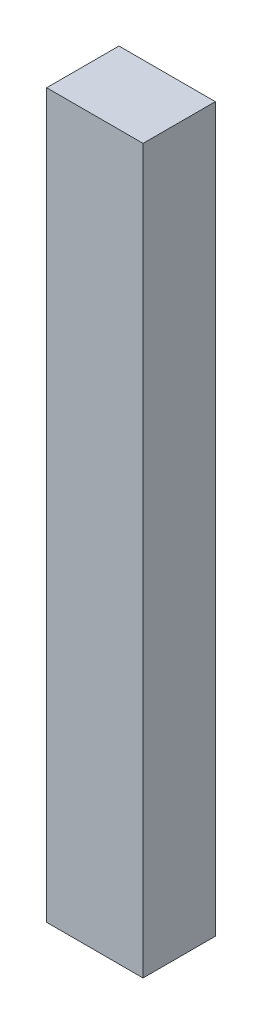
ISO-10303-21;
HEADER;
FILE_DESCRIPTION(('STEP AP214'),'2;1');
FILE_NAME('part.step','',(''),(''),'','','');
FILE_SCHEMA(('AUTOMOTIVE_DESIGN { 1 0 10303 214 1 1 1 1 }'));
ENDSEC;
DATA;
#1=APPLICATION_CONTEXT('core data for automotive mechanical design processes');
#2=APPLICATION_PROTOCOL_DEFINITION('international standard','automotive_design',2000,#1);
#3=PRODUCT_CONTEXT('',#1,'mechanical');
#4=PRODUCT('Part','Part','',(#3));
#5=PRODUCT_RELATED_PRODUCT_CATEGORY('part','',(#4));
#6=PRODUCT_DEFINITION_FORMATION('','',#4);
#7=PRODUCT_DEFINITION_CONTEXT('part definition',#1,'design');
#8=PRODUCT_DEFINITION('design','',#6,#7);
#9=PRODUCT_DEFINITION_SHAPE('','',#8);
#10=(LENGTH_UNIT() NAMED_UNIT(*) SI_UNIT(.MILLI.,.METRE.));
#11=(NAMED_UNIT(*) PLANE_ANGLE_UNIT() SI_UNIT($,.RADIAN.));
#12=(NAMED_UNIT(*) SI_UNIT($,.STERADIAN.) SOLID_ANGLE_UNIT());
#13=UNCERTAINTY_MEASURE_WITH_UNIT(LENGTH_MEASURE(1.E-05),#10,'distance_accuracy_value','');
#14=(GEOMETRIC_REPRESENTATION_CONTEXT(3) GLOBAL_UNCERTAINTY_ASSIGNED_CONTEXT((#13)) GLOBAL_UNIT_ASSIGNED_CONTEXT((#10,
#11,#12)) REPRESENTATION_CONTEXT('',''));
#15=CARTESIAN_POINT('',(0.,0.,0.));
#16=DIRECTION('',(0.,0.,1.));
#17=DIRECTION('',(1.,0.,0.));
#18=AXIS2_PLACEMENT_3D('',#15,#16,#17);
#19=CARTESIAN_POINT('',(4.,30.,3.));
#20=DIRECTION('',(-1.,0.,0.));
#21=DIRECTION('',(0.,0.,1.));
#22=AXIS2_PLACEMENT_3D('',#19,#20,#21);
#23=PLANE('',#22);
#24=DIRECTION('',(0.,0.,-1.));
#25=VECTOR('',#24,1.);
#26=CARTESIAN_POINT('',(4.,-30.,3.));
#27=LINE('',#26,#25);
#28=CARTESIAN_POINT('',(4.,-30.,3.));
#29=VERTEX_POINT('',#28);
#30=CARTESIAN_POINT('',(4.,-30.,-3.));
#31=VERTEX_POINT('',#30);
#32=EDGE_CURVE('E102',#29,#31,#27,.T.);
#33=ORIENTED_EDGE('',*,*,#32,.T.);
#34=DIRECTION('',(0.,-1.,0.));
#35=VECTOR('',#34,1.);
#36=CARTESIAN_POINT('',(4.,30.,-3.));
#37=LINE('',#36,#35);
#38=CARTESIAN_POINT('',(4.,30.,-3.));
#39=VERTEX_POINT('',#38);
#40=EDGE_CURVE('E11',#39,#31,#37,.T.);
#41=ORIENTED_EDGE('',*,*,#40,.F.);
#42=DIRECTION('',(0.,0.,-1.));
#43=VECTOR('',#42,1.);
#44=CARTESIAN_POINT('',(4.,30.,3.));
#45=LINE('',#44,#43);
#46=CARTESIAN_POINT('',(4.,30.,3.));
#47=VERTEX_POINT('',#46);
#48=EDGE_CURVE('E90',#47,#39,#45,.T.);
#49=ORIENTED_EDGE('',*,*,#48,.F.);
#50=DIRECTION('',(0.,-1.,0.));
#51=VECTOR('',#50,1.);
#52=CARTESIAN_POINT('',(4.,30.,3.));
#53=LINE('',#52,#51);
#54=EDGE_CURVE('E98',#47,#29,#53,.T.);
#55=ORIENTED_EDGE('',*,*,#54,.T.);
#56=EDGE_LOOP('',(#33,#41,#49,#55));
#57=FACE_BOUND('',#56,.T.);
#58=ADVANCED_FACE('F39',(#57),#23,.F.);
#59=CARTESIAN_POINT('',(4.,30.,-3.));
#60=DIRECTION('',(0.,0.,1.));
#61=DIRECTION('',(1.,0.,0.));
#62=AXIS2_PLACEMENT_3D('',#59,#60,#61);
#63=PLANE('',#62);
#64=DIRECTION('',(-1.,0.,0.));
#65=VECTOR('',#64,1.);
#66=CARTESIAN_POINT('',(4.,-30.,-3.));
#67=LINE('',#66,#65);
#68=CARTESIAN_POINT('',(-4.,-30.,-3.));
#69=VERTEX_POINT('',#68);
#70=EDGE_CURVE('E94',#31,#69,#67,.T.);
#71=ORIENTED_EDGE('',*,*,#70,.T.);
#72=DIRECTION('',(0.,-1.,0.));
#73=VECTOR('',#72,1.);
#74=CARTESIAN_POINT('',(-4.,30.,-3.));
#75=LINE('',#74,#73);
#76=CARTESIAN_POINT('',(-4.,30.,-3.));
#77=VERTEX_POINT('',#76);
#78=EDGE_CURVE('E47',#77,#69,#75,.T.);
#79=ORIENTED_EDGE('',*,*,#78,.F.);
#80=DIRECTION('',(-1.,0.,0.));
#81=VECTOR('',#80,1.);
#82=CARTESIAN_POINT('',(4.,30.,-3.));
#83=LINE('',#82,#81);
#84=EDGE_CURVE('E85',#39,#77,#83,.T.);
#85=ORIENTED_EDGE('',*,*,#84,.F.);
#86=ORIENTED_EDGE('',*,*,#40,.T.);
#87=EDGE_LOOP('',(#71,#79,#85,#86));
#88=FACE_BOUND('',#87,.T.);
#89=ADVANCED_FACE('F93',(#88),#63,.F.);
#90=CARTESIAN_POINT('',(-4.,30.,3.));
#91=DIRECTION('',(1.,0.,0.));
#92=DIRECTION('',(0.,0.,-1.));
#93=AXIS2_PLACEMENT_3D('',#90,#91,#92);
#94=PLANE('',#93);
#95=DIRECTION('',(0.,0.,1.));
#96=VECTOR('',#95,1.);
#97=CARTESIAN_POINT('',(-4.,-30.,3.));
#98=LINE('',#97,#96);
#99=CARTESIAN_POINT('',(-4.,-30.,3.));
#100=VERTEX_POINT('',#99);
#101=EDGE_CURVE('E72',#69,#100,#98,.T.);
#102=ORIENTED_EDGE('',*,*,#101,.T.);
#103=DIRECTION('',(0.,-1.,0.));
#104=VECTOR('',#103,1.);
#105=CARTESIAN_POINT('',(-4.,30.,3.));
#106=LINE('',#105,#104);
#107=CARTESIAN_POINT('',(-4.,30.,3.));
#108=VERTEX_POINT('',#107);
#109=EDGE_CURVE('E95',#108,#100,#106,.T.);
#110=ORIENTED_EDGE('',*,*,#109,.F.);
#111=DIRECTION('',(0.,0.,1.));
#112=VECTOR('',#111,1.);
#113=CARTESIAN_POINT('',(-4.,30.,3.));
#114=LINE('',#113,#112);
#115=EDGE_CURVE('E88',#77,#108,#114,.T.);
#116=ORIENTED_EDGE('',*,*,#115,.F.);
#117=ORIENTED_EDGE('',*,*,#78,.T.);
#118=EDGE_LOOP('',(#102,#110,#116,#117));
#119=FACE_BOUND('',#118,.T.);
#120=ADVANCED_FACE('F96',(#119),#94,.F.);
#121=CARTESIAN_POINT('',(4.,30.,3.));
#122=DIRECTION('',(0.,0.,-1.));
#123=DIRECTION('',(-1.,0.,0.));
#124=AXIS2_PLACEMENT_3D('',#121,#122,#123);
#125=PLANE('',#124);
#126=DIRECTION('',(1.,0.,0.));
#127=VECTOR('',#126,1.);
#128=CARTESIAN_POINT('',(4.,-30.,3.));
#129=LINE('',#128,#127);
#130=EDGE_CURVE('E78',#100,#29,#129,.T.);
#131=ORIENTED_EDGE('',*,*,#130,.T.);
#132=ORIENTED_EDGE('',*,*,#54,.F.);
#133=DIRECTION('',(1.,0.,0.));
#134=VECTOR('',#133,1.);
#135=CARTESIAN_POINT('',(4.,30.,3.));
#136=LINE('',#135,#134);
#137=EDGE_CURVE('E55',#108,#47,#136,.T.);
#138=ORIENTED_EDGE('',*,*,#137,.F.);
#139=ORIENTED_EDGE('',*,*,#109,.T.);
#140=EDGE_LOOP('',(#131,#132,#138,#139));
#141=FACE_BOUND('',#140,.T.);
#142=ADVANCED_FACE('F109',(#141),#125,.F.);
#143=CARTESIAN_POINT('',(0.,30.,0.));
#144=DIRECTION('',(0.,1.,0.));
#145=DIRECTION('',(0.,0.,1.));
#146=AXIS2_PLACEMENT_3D('',#143,#144,#145);
#147=PLANE('',#146);
#148=ORIENTED_EDGE('',*,*,#48,.T.);
#149=ORIENTED_EDGE('',*,*,#84,.T.);
#150=ORIENTED_EDGE('',*,*,#115,.T.);
#151=ORIENTED_EDGE('',*,*,#137,.T.);
#152=EDGE_LOOP('',(#148,#149,#150,#151));
#153=FACE_BOUND('',#152,.T.);
#154=ADVANCED_FACE('F86',(#153),#147,.T.);
#155=CARTESIAN_POINT('',(0.,-30.,0.));
#156=DIRECTION('',(0.,1.,0.));
#157=DIRECTION('',(0.,0.,1.));
#158=AXIS2_PLACEMENT_3D('',#155,#156,#157);
#159=PLANE('',#158);
#160=ORIENTED_EDGE('',*,*,#32,.F.);
#161=ORIENTED_EDGE('',*,*,#130,.F.);
#162=ORIENTED_EDGE('',*,*,#101,.F.);
#163=ORIENTED_EDGE('',*,*,#70,.F.);
#164=EDGE_LOOP('',(#160,#161,#162,#163));
#165=FACE_BOUND('',#164,.T.);
#166=ADVANCED_FACE('F112',(#165),#159,.F.);
#167=CLOSED_SHELL('',(#58,#89,#120,#142,#154,#166));
#168=MANIFOLD_SOLID_BREP('B2',#167);
#169=ADVANCED_BREP_SHAPE_REPRESENTATION('',(#18,#168),#14);
#170=SHAPE_DEFINITION_REPRESENTATION(#9,#169);
ENDSEC;
END-ISO-10303-21;
